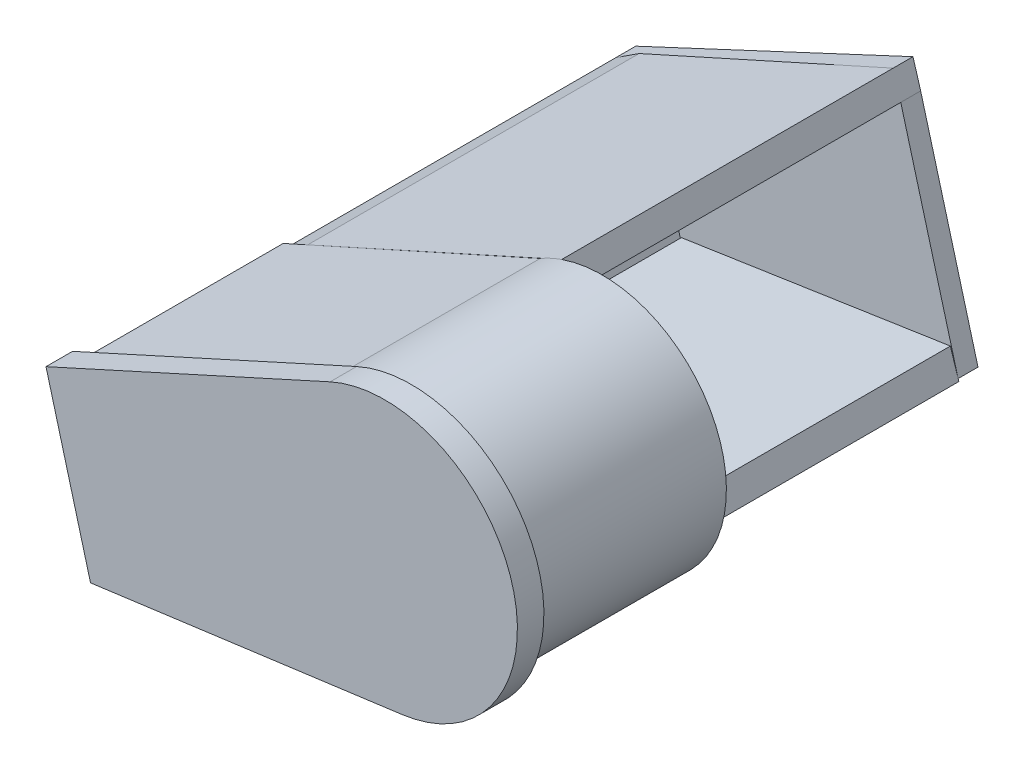
ISO-10303-21;
HEADER;
FILE_DESCRIPTION(('STEP AP214'),'2;1');
FILE_NAME('part.step','',(''),(''),'','','');
FILE_SCHEMA(('AUTOMOTIVE_DESIGN { 1 0 10303 214 1 1 1 1 }'));
ENDSEC;
DATA;
#1=APPLICATION_CONTEXT('core data for automotive mechanical design processes');
#2=APPLICATION_PROTOCOL_DEFINITION('international standard','automotive_design',2000,#1);
#3=PRODUCT_CONTEXT('',#1,'mechanical');
#4=PRODUCT('Part','Part','',(#3));
#5=PRODUCT_RELATED_PRODUCT_CATEGORY('part','',(#4));
#6=PRODUCT_DEFINITION_FORMATION('','',#4);
#7=PRODUCT_DEFINITION_CONTEXT('part definition',#1,'design');
#8=PRODUCT_DEFINITION('design','',#6,#7);
#9=PRODUCT_DEFINITION_SHAPE('','',#8);
#10=(LENGTH_UNIT() NAMED_UNIT(*) SI_UNIT(.MILLI.,.METRE.));
#11=(NAMED_UNIT(*) PLANE_ANGLE_UNIT() SI_UNIT($,.RADIAN.));
#12=(NAMED_UNIT(*) SI_UNIT($,.STERADIAN.) SOLID_ANGLE_UNIT());
#13=UNCERTAINTY_MEASURE_WITH_UNIT(LENGTH_MEASURE(1.E-05),#10,'distance_accuracy_value','');
#14=(GEOMETRIC_REPRESENTATION_CONTEXT(3) GLOBAL_UNCERTAINTY_ASSIGNED_CONTEXT((#13)) GLOBAL_UNIT_ASSIGNED_CONTEXT((#10,
#11,#12)) REPRESENTATION_CONTEXT('',''));
#15=CARTESIAN_POINT('',(0.,0.,0.));
#16=DIRECTION('',(0.,0.,1.));
#17=DIRECTION('',(1.,0.,0.));
#18=AXIS2_PLACEMENT_3D('',#15,#16,#17);
#19=CARTESIAN_POINT('',(0.,0.,-84.));
#20=DIRECTION('',(0.,0.,1.));
#21=DIRECTION('',(1.,0.,0.));
#22=AXIS2_PLACEMENT_3D('',#19,#20,#21);
#23=PLANE('',#22);
#24=DIRECTION('',(0.90601696578967,0.423241370498301,0.));
#25=VECTOR('',#24,1.);
#26=CARTESIAN_POINT('',(-47.9678907221855,-1.86750662905844,-84.));
#27=LINE('',#26,#25);
#28=CARTESIAN_POINT('',(-47.9678907221855,-1.86750662905844,-84.));
#29=VERTEX_POINT('',#28);
#30=CARTESIAN_POINT('',(-6.13749157275297,17.6733586449886,-84.));
#31=VERTEX_POINT('',#30);
#32=EDGE_CURVE('E276',#29,#31,#27,.T.);
#33=ORIENTED_EDGE('',*,*,#32,.F.);
#34=DIRECTION('',(0.837415670836213,0.546566550602884,0.));
#35=VECTOR('',#34,1.);
#36=CARTESIAN_POINT('',(-44.4570682641742,0.42394573740878,-84.));
#37=LINE('',#36,#35);
#38=CARTESIAN_POINT('',(-44.4570682641742,0.42394573740878,-84.));
#39=VERTEX_POINT('',#38);
#40=EDGE_CURVE('E351',#29,#39,#37,.T.);
#41=ORIENTED_EDGE('',*,*,#40,.T.);
#42=DIRECTION('',(0.911871599442209,0.410475560942071,0.));
#43=VECTOR('',#42,1.);
#44=CARTESIAN_POINT('',(-44.4570682641742,0.42394573740878,-84.));
#45=LINE('',#44,#43);
#46=EDGE_CURVE('E293',#39,#31,#45,.T.);
#47=ORIENTED_EDGE('',*,*,#46,.T.);
#48=EDGE_LOOP('',(#33,#41,#47));
#49=FACE_BOUND('',#48,.T.);
#50=ADVANCED_FACE('F73',(#49),#23,.F.);
#51=DIRECTION('',(-0.988123455644098,-0.153662085128267,0.));
#52=VECTOR('',#51,1.);
#53=CARTESIAN_POINT('',(3.67019319079095,-17.9862335505669,-84.));
#54=LINE('',#53,#52);
#55=CARTESIAN_POINT('',(-37.1279364806681,-24.3307096773514,-84.));
#56=VERTEX_POINT('',#55);
#57=CARTESIAN_POINT('',(-40.8961928307478,-24.9167074337488,-84.));
#58=VERTEX_POINT('',#57);
#59=EDGE_CURVE('E90',#56,#58,#54,.T.);
#60=ORIENTED_EDGE('',*,*,#59,.F.);
#61=DIRECTION('',(0.283889596067548,-0.958856974342162,0.));
#62=VECTOR('',#61,1.);
#63=CARTESIAN_POINT('',(-37.1231199205319,-24.346977946224,-84.));
#64=LINE('',#63,#62);
#65=CARTESIAN_POINT('',(-37.1231199205319,-24.346977946224,-84.));
#66=VERTEX_POINT('',#65);
#67=EDGE_CURVE('E355',#56,#66,#64,.T.);
#68=ORIENTED_EDGE('',*,*,#67,.T.);
#69=DIRECTION('',(-0.988791000123282,-0.149306255981453,0.));
#70=VECTOR('',#69,1.);
#71=CARTESIAN_POINT('',(-40.8961928307478,-24.9167074337488,-84.));
#72=LINE('',#71,#70);
#73=EDGE_CURVE('E349',#66,#58,#72,.T.);
#74=ORIENTED_EDGE('',*,*,#73,.T.);
#75=EDGE_LOOP('',(#60,#68,#74));
#76=FACE_BOUND('',#75,.T.);
#77=ADVANCED_FACE('F495',(#76),#23,.F.);
#78=CARTESIAN_POINT('',(0.,0.,-84.));
#79=DIRECTION('',(0.,0.,1.));
#80=DIRECTION('',(1.,0.,0.));
#81=AXIS2_PLACEMENT_3D('',#78,#79,#80);
#82=PLANE('',#81);
#83=CARTESIAN_POINT('',(3.67019319079219,-17.9862335505711,-84.));
#84=VERTEX_POINT('',#83);
#85=CARTESIAN_POINT('',(-36.857705330564,-24.288686302889,-84.));
#86=VERTEX_POINT('',#85);
#87=EDGE_CURVE('E98',#84,#86,#54,.T.);
#88=ORIENTED_EDGE('',*,*,#87,.F.);
#89=DIRECTION('',(0.303979186168957,-0.952678673203121,0.));
#90=VECTOR('',#89,1.);
#91=CARTESIAN_POINT('',(3.7777580074753,-18.3233444828438,-84.));
#92=LINE('',#91,#90);
#93=CARTESIAN_POINT('',(3.7777580074753,-18.3233444828438,-84.));
#94=VERTEX_POINT('',#93);
#95=EDGE_CURVE('E323',#84,#94,#92,.T.);
#96=ORIENTED_EDGE('',*,*,#95,.T.);
#97=DIRECTION('',(-0.988913553374433,-0.148492370013923,0.));
#98=VECTOR('',#97,1.);
#99=CARTESIAN_POINT('',(-36.8161849180462,-24.4188123552901,-84.));
#100=LINE('',#99,#98);
#101=CARTESIAN_POINT('',(-36.8161849180462,-24.4188123552901,-84.));
#102=VERTEX_POINT('',#101);
#103=EDGE_CURVE('E313',#94,#102,#100,.T.);
#104=ORIENTED_EDGE('',*,*,#103,.T.);
#105=DIRECTION('',(-0.303979186168956,0.952678673203121,0.));
#106=VECTOR('',#105,1.);
#107=CARTESIAN_POINT('',(-38.0836108098652,-20.4466666560439,-84.));
#108=LINE('',#107,#106);
#109=EDGE_CURVE('E318',#102,#86,#108,.T.);
#110=ORIENTED_EDGE('',*,*,#109,.T.);
#111=EDGE_LOOP('',(#88,#96,#104,#110));
#112=FACE_BOUND('',#111,.T.);
#113=ADVANCED_FACE('F501',(#112),#82,.F.);
#114=CARTESIAN_POINT('',(0.,0.,-34.));
#115=DIRECTION('',(0.,0.,1.));
#116=DIRECTION('',(1.,0.,0.));
#117=AXIS2_PLACEMENT_3D('',#114,#115,#116);
#118=PLANE('',#117);
#119=DIRECTION('',(-0.907412634685227,-0.42024077671451,0.));
#120=VECTOR('',#119,1.);
#121=CARTESIAN_POINT('',(-4.98355760127701,13.7758659161011,-34.));
#122=LINE('',#121,#120);
#123=CARTESIAN_POINT('',(-43.1590575086167,-3.90396475772491,-34.));
#124=VERTEX_POINT('',#123);
#125=CARTESIAN_POINT('',(-43.1736933308374,-3.91074289708818,-34.));
#126=VERTEX_POINT('',#125);
#127=EDGE_CURVE('E282',#124,#126,#122,.T.);
#128=ORIENTED_EDGE('',*,*,#127,.F.);
#129=DIRECTION('',(-0.293314165556702,0.956016108799311,0.));
#130=VECTOR('',#129,1.);
#131=CARTESIAN_POINT('',(-38.0836108098652,-20.4466666560439,-34.));
#132=LINE('',#131,#130);
#133=CARTESIAN_POINT('',(-38.0836108098652,-20.4466666560439,-34.));
#134=VERTEX_POINT('',#133);
#135=EDGE_CURVE('E399',#134,#124,#132,.T.);
#136=ORIENTED_EDGE('',*,*,#135,.F.);
#137=DIRECTION('',(-0.303979186168956,0.952678673203121,0.));
#138=VECTOR('',#137,1.);
#139=CARTESIAN_POINT('',(-38.0836108098652,-20.4466666560439,-34.));
#140=LINE('',#139,#138);
#141=CARTESIAN_POINT('',(-36.8521606666918,-24.3060634236309,-34.));
#142=VERTEX_POINT('',#141);
#143=EDGE_CURVE('E331',#142,#134,#140,.T.);
#144=ORIENTED_EDGE('',*,*,#143,.F.);
#145=DIRECTION('',(-0.988791000123282,-0.149306255981453,0.));
#146=VECTOR('',#145,1.);
#147=CARTESIAN_POINT('',(5.01864887489931,-17.9836213637942,-34.));
#148=LINE('',#147,#146);
#149=CARTESIAN_POINT('',(-37.1231199205319,-24.346977946224,-34.));
#150=VERTEX_POINT('',#149);
#151=EDGE_CURVE('E405',#142,#150,#148,.T.);
#152=ORIENTED_EDGE('',*,*,#151,.T.);
#153=DIRECTION('',(0.283889596067548,-0.958856974342162,0.));
#154=VECTOR('',#153,1.);
#155=CARTESIAN_POINT('',(-37.1231199205319,-24.346977946224,-34.));
#156=LINE('',#155,#154);
#157=EDGE_CURVE('E352',#126,#150,#156,.T.);
#158=ORIENTED_EDGE('',*,*,#157,.F.);
#159=EDGE_LOOP('',(#128,#136,#144,#152,#158));
#160=FACE_BOUND('',#159,.T.);
#161=ADVANCED_FACE('F526',(#160),#118,.F.);
#162=DIRECTION('',(0.911871599442209,0.410475560942071,0.));
#163=VECTOR('',#162,1.);
#164=CARTESIAN_POINT('',(-44.4570682641742,0.42394573740878,-34.));
#165=LINE('',#164,#163);
#166=CARTESIAN_POINT('',(-9.16103447280697,16.3123222132242,-34.));
#167=VERTEX_POINT('',#166);
#168=CARTESIAN_POINT('',(-6.13749157275297,17.6733586449886,-34.));
#169=VERTEX_POINT('',#168);
#170=EDGE_CURVE('E297',#167,#169,#165,.T.);
#171=ORIENTED_EDGE('',*,*,#170,.F.);
#172=CARTESIAN_POINT('',(0.,0.,-34.));
#173=DIRECTION('',(0.,0.,-1.));
#174=DIRECTION('',(-1.,0.,0.));
#175=AXIS2_PLACEMENT_3D('',#172,#173,#174);
#176=CIRCLE('',#175,18.7087254670115);
#177=EDGE_CURVE('E374',#167,#169,#176,.T.);
#178=ORIENTED_EDGE('',*,*,#177,.T.);
#179=EDGE_LOOP('',(#171,#178));
#180=FACE_BOUND('',#179,.T.);
#181=ADVANCED_FACE('F529',(#180),#118,.F.);
#182=DIRECTION('',(0.283889596067548,-0.958856974342161,0.));
#183=VECTOR('',#182,1.);
#184=CARTESIAN_POINT('',(-6.13749157275297,17.6733586449886,-34.));
#185=LINE('',#184,#183);
#186=CARTESIAN_POINT('',(-4.98355760127701,13.7758659161011,-34.));
#187=VERTEX_POINT('',#186);
#188=EDGE_CURVE('E294',#169,#187,#185,.T.);
#189=ORIENTED_EDGE('',*,*,#188,.F.);
#190=CARTESIAN_POINT('',(3.77775800747527,-18.3233444828438,-34.));
#191=VERTEX_POINT('',#190);
#192=EDGE_CURVE('E375',#169,#191,#176,.T.);
#193=ORIENTED_EDGE('',*,*,#192,.T.);
#194=DIRECTION('',(0.303979186168957,-0.952678673203121,0.));
#195=VECTOR('',#194,1.);
#196=CARTESIAN_POINT('',(3.7777580074753,-18.3233444828438,-34.));
#197=LINE('',#196,#195);
#198=CARTESIAN_POINT('',(2.49993071514775,-14.3186005239573,-34.));
#199=VERTEX_POINT('',#198);
#200=EDGE_CURVE('E317',#199,#191,#197,.T.);
#201=ORIENTED_EDGE('',*,*,#200,.F.);
#202=DIRECTION('',(-0.988791000123282,-0.149306255981453,0.));
#203=VECTOR('',#202,1.);
#204=CARTESIAN_POINT('',(4.4214238509735,-14.0284573633011,-34.));
#205=LINE('',#204,#203);
#206=CARTESIAN_POINT('',(4.4214238509735,-14.0284573633011,-34.));
#207=VERTEX_POINT('',#206);
#208=EDGE_CURVE('E402',#207,#199,#205,.T.);
#209=ORIENTED_EDGE('',*,*,#208,.F.);
#210=CARTESIAN_POINT('',(0.,0.,-34.));
#211=DIRECTION('',(0.,0.,-1.));
#212=DIRECTION('',(-1.,0.,0.));
#213=AXIS2_PLACEMENT_3D('',#210,#211,#212);
#214=CIRCLE('',#213,14.7087254670115);
#215=CARTESIAN_POINT('',(-4.42142385097353,14.0284573633011,-34.));
#216=VERTEX_POINT('',#215);
#217=EDGE_CURVE('E373',#216,#207,#214,.T.);
#218=ORIENTED_EDGE('',*,*,#217,.F.);
#219=DIRECTION('',(0.912145278941702,0.409867039543757,0.));
#220=VECTOR('',#219,1.);
#221=CARTESIAN_POINT('',(-43.300858444141,-3.44178462964706,-34.));
#222=LINE('',#221,#220);
#223=EDGE_CURVE('E394',#187,#216,#222,.T.);
#224=ORIENTED_EDGE('',*,*,#223,.F.);
#225=EDGE_LOOP('',(#189,#193,#201,#209,#218,#224));
#226=FACE_BOUND('',#225,.T.);
#227=ADVANCED_FACE('F510',(#226),#118,.F.);
#228=CARTESIAN_POINT('',(-37.1231199205319,-24.346977946224,-84.));
#229=DIRECTION('',(-0.958856974342162,-0.283889596067548,0.));
#230=DIRECTION('',(0.283889596067548,-0.958856974342162,0.));
#231=AXIS2_PLACEMENT_3D('',#228,#229,#230);
#232=PLANE('',#231);
#233=DIRECTION('',(0.,0.,1.));
#234=VECTOR('',#233,1.);
#235=CARTESIAN_POINT('',(-43.1736933308374,-3.91074289708818,-84.));
#236=LINE('',#235,#234);
#237=CARTESIAN_POINT('',(-43.1736933308374,-3.91074289708818,-84.));
#238=VERTEX_POINT('',#237);
#239=EDGE_CURVE('E306',#238,#126,#236,.T.);
#240=ORIENTED_EDGE('',*,*,#239,.T.);
#241=ORIENTED_EDGE('',*,*,#157,.T.);
#242=DIRECTION('',(0.,0.,1.));
#243=VECTOR('',#242,1.);
#244=CARTESIAN_POINT('',(-37.1231199205319,-24.346977946224,-84.));
#245=LINE('',#244,#243);
#246=EDGE_CURVE('E359',#66,#150,#245,.T.);
#247=ORIENTED_EDGE('',*,*,#246,.F.);
#248=ORIENTED_EDGE('',*,*,#67,.F.);
#249=EDGE_CURVE('E356',#238,#56,#64,.T.);
#250=ORIENTED_EDGE('',*,*,#249,.F.);
#251=EDGE_LOOP('',(#240,#241,#247,#248,#250));
#252=FACE_BOUND('',#251,.T.);
#253=ADVANCED_FACE('F506',(#252),#232,.F.);
#254=DIRECTION('',(-0.988913553374433,-0.148492370013923,0.));
#255=VECTOR('',#254,1.);
#256=CARTESIAN_POINT('',(-36.8161849180462,-24.4188123552901,-34.));
#257=LINE('',#256,#255);
#258=CARTESIAN_POINT('',(1.77026498516536,-18.6247837700818,-34.));
#259=VERTEX_POINT('',#258);
#260=EDGE_CURVE('E328',#191,#259,#257,.T.);
#261=ORIENTED_EDGE('',*,*,#260,.F.);
#262=EDGE_CURVE('E376',#191,#259,#176,.T.);
#263=ORIENTED_EDGE('',*,*,#262,.T.);
#264=EDGE_LOOP('',(#261,#263));
#265=FACE_BOUND('',#264,.T.);
#266=ADVANCED_FACE('F509',(#265),#118,.F.);
#267=DIRECTION('',(0.837415670836213,0.546566550602884,0.));
#268=VECTOR('',#267,1.);
#269=CARTESIAN_POINT('',(-44.4570682641742,0.42394573740878,-34.));
#270=LINE('',#269,#268);
#271=CARTESIAN_POINT('',(-47.9678907221855,-1.86750662905844,-34.));
#272=VERTEX_POINT('',#271);
#273=CARTESIAN_POINT('',(-44.4570682641742,0.42394573740878,-34.));
#274=VERTEX_POINT('',#273);
#275=EDGE_CURVE('E348',#272,#274,#270,.T.);
#276=ORIENTED_EDGE('',*,*,#275,.F.);
#277=DIRECTION('',(-0.293314165556702,0.956016108799311,0.));
#278=VECTOR('',#277,1.);
#279=CARTESIAN_POINT('',(-41.9076752450625,-21.6199233182707,-34.));
#280=LINE('',#279,#278);
#281=CARTESIAN_POINT('',(-48.1603799211926,-1.24011526297381,-34.));
#282=VERTEX_POINT('',#281);
#283=EDGE_CURVE('E409',#272,#282,#280,.T.);
#284=ORIENTED_EDGE('',*,*,#283,.T.);
#285=DIRECTION('',(0.912145278941702,0.409867039543757,0.));
#286=VECTOR('',#285,1.);
#287=CARTESIAN_POINT('',(-44.940326602316,0.20679648611975,-34.));
#288=LINE('',#287,#286);
#289=EDGE_CURVE('E391',#282,#274,#288,.T.);
#290=ORIENTED_EDGE('',*,*,#289,.T.);
#291=EDGE_LOOP('',(#276,#284,#290));
#292=FACE_BOUND('',#291,.T.);
#293=ADVANCED_FACE('F531',(#292),#118,.F.);
#294=CARTESIAN_POINT('',(1.17834834539366,0.,-4.));
#295=DIRECTION('',(0.,0.,1.));
#296=DIRECTION('',(1.,0.,0.));
#297=AXIS2_PLACEMENT_3D('',#294,#295,#296);
#298=CYLINDRICAL_SURFACE('',#297,20.);
#299=CARTESIAN_POINT('',(1.17834834539366,0.,0.));
#300=DIRECTION('',(0.,0.,1.));
#301=DIRECTION('',(1.,0.,0.));
#302=AXIS2_PLACEMENT_3D('',#299,#300,#301);
#303=CIRCLE('',#302,20.);
#304=CARTESIAN_POINT('',(3.83433501679677,-19.822858895763,0.));
#305=VERTEX_POINT('',#304);
#306=CARTESIAN_POINT('',(-7.08482247893124,18.2131822570364,0.));
#307=VERTEX_POINT('',#306);
#308=EDGE_CURVE('E443',#305,#307,#303,.T.);
#309=ORIENTED_EDGE('',*,*,#308,.F.);
#310=DIRECTION('',(0.,0.,1.));
#311=VECTOR('',#310,1.);
#312=CARTESIAN_POINT('',(3.83433501679677,-19.822858895763,-4.));
#313=LINE('',#312,#311);
#314=CARTESIAN_POINT('',(3.83433501679677,-19.822858895763,-4.));
#315=VERTEX_POINT('',#314);
#316=EDGE_CURVE('E12',#315,#305,#313,.T.);
#317=ORIENTED_EDGE('',*,*,#316,.F.);
#318=CARTESIAN_POINT('',(1.17834834539366,0.,-4.));
#319=DIRECTION('',(0.,0.,1.));
#320=DIRECTION('',(1.,0.,0.));
#321=AXIS2_PLACEMENT_3D('',#318,#319,#320);
#322=CIRCLE('',#321,20.);
#323=CARTESIAN_POINT('',(-7.08482247893124,18.2131822570364,-4.));
#324=VERTEX_POINT('',#323);
#325=EDGE_CURVE('E444',#315,#324,#322,.T.);
#326=ORIENTED_EDGE('',*,*,#325,.T.);
#327=DIRECTION('',(0.,0.,1.));
#328=VECTOR('',#327,1.);
#329=CARTESIAN_POINT('',(-7.08482247893124,18.2131822570364,-4.));
#330=LINE('',#329,#328);
#331=EDGE_CURVE('E77',#324,#307,#330,.T.);
#332=ORIENTED_EDGE('',*,*,#331,.T.);
#333=EDGE_LOOP('',(#309,#317,#326,#332));
#334=FACE_BOUND('',#333,.T.);
#335=ADVANCED_FACE('F75',(#334),#298,.T.);
#336=CARTESIAN_POINT('',(3.83433501679677,-19.822858895763,-4.));
#337=DIRECTION('',(0.132799333570155,-0.991142944788149,0.));
#338=DIRECTION('',(0.991142944788148,0.132799333570155,0.));
#339=AXIS2_PLACEMENT_3D('',#336,#337,#338);
#340=PLANE('',#339);
#341=DIRECTION('',(0.991142944788148,0.132799333570155,0.));
#342=VECTOR('',#341,1.);
#343=CARTESIAN_POINT('',(3.83433501679677,-19.822858895763,0.));
#344=LINE('',#343,#342);
#345=CARTESIAN_POINT('',(-43.2302468250683,-26.1288565686755,0.));
#346=VERTEX_POINT('',#345);
#347=EDGE_CURVE('E448',#346,#305,#344,.T.);
#348=ORIENTED_EDGE('',*,*,#347,.F.);
#349=DIRECTION('',(0.,0.,1.));
#350=VECTOR('',#349,1.);
#351=CARTESIAN_POINT('',(-43.2302468250683,-26.1288565686755,-4.));
#352=LINE('',#351,#350);
#353=CARTESIAN_POINT('',(-43.2302468250683,-26.1288565686755,-4.));
#354=VERTEX_POINT('',#353);
#355=EDGE_CURVE('E82',#354,#346,#352,.T.);
#356=ORIENTED_EDGE('',*,*,#355,.F.);
#357=DIRECTION('',(0.991142944788148,0.132799333570155,0.));
#358=VECTOR('',#357,1.);
#359=CARTESIAN_POINT('',(3.83433501679677,-19.822858895763,-4.));
#360=LINE('',#359,#358);
#361=EDGE_CURVE('E454',#354,#315,#360,.T.);
#362=ORIENTED_EDGE('',*,*,#361,.T.);
#363=ORIENTED_EDGE('',*,*,#316,.T.);
#364=EDGE_LOOP('',(#348,#356,#362,#363));
#365=FACE_BOUND('',#364,.T.);
#366=ADVANCED_FACE('F480',(#365),#340,.T.);
#367=CARTESIAN_POINT('',(-49.9459074103825,-1.2325390620731,-4.));
#368=DIRECTION('',(-0.96549097930674,-0.260436496822762,0.));
#369=DIRECTION('',(0.260436496822762,-0.96549097930674,0.));
#370=AXIS2_PLACEMENT_3D('',#367,#368,#369);
#371=PLANE('',#370);
#372=DIRECTION('',(0.260436496822762,-0.96549097930674,0.));
#373=VECTOR('',#372,1.);
#374=CARTESIAN_POINT('',(-49.9459074103825,-1.2325390620731,0.));
#375=LINE('',#374,#373);
#376=CARTESIAN_POINT('',(-49.9459074103825,-1.2325390620731,0.));
#377=VERTEX_POINT('',#376);
#378=EDGE_CURVE('E462',#377,#346,#375,.T.);
#379=ORIENTED_EDGE('',*,*,#378,.F.);
#380=DIRECTION('',(0.,0.,1.));
#381=VECTOR('',#380,1.);
#382=CARTESIAN_POINT('',(-49.9459074103825,-1.2325390620731,-4.));
#383=LINE('',#382,#381);
#384=CARTESIAN_POINT('',(-49.9459074103825,-1.2325390620731,-4.));
#385=VERTEX_POINT('',#384);
#386=EDGE_CURVE('E467',#385,#377,#383,.T.);
#387=ORIENTED_EDGE('',*,*,#386,.F.);
#388=DIRECTION('',(0.260436496822762,-0.96549097930674,0.));
#389=VECTOR('',#388,1.);
#390=CARTESIAN_POINT('',(-49.9459074103825,-1.2325390620731,-4.));
#391=LINE('',#390,#389);
#392=EDGE_CURVE('E451',#385,#354,#391,.T.);
#393=ORIENTED_EDGE('',*,*,#392,.T.);
#394=ORIENTED_EDGE('',*,*,#355,.T.);
#395=EDGE_LOOP('',(#379,#387,#393,#394));
#396=FACE_BOUND('',#395,.T.);
#397=ADVANCED_FACE('F486',(#396),#371,.T.);
#398=CARTESIAN_POINT('',(-7.08482247893124,18.2131822570364,-4.));
#399=DIRECTION('',(-0.413158541216245,0.91065911285182,0.));
#400=DIRECTION('',(-0.91065911285182,-0.413158541216245,0.));
#401=AXIS2_PLACEMENT_3D('',#398,#399,#400);
#402=PLANE('',#401);
#403=DIRECTION('',(-0.91065911285182,-0.413158541216245,0.));
#404=VECTOR('',#403,1.);
#405=CARTESIAN_POINT('',(-7.08482247893124,18.2131822570364,0.));
#406=LINE('',#405,#404);
#407=EDGE_CURVE('E459',#307,#377,#406,.T.);
#408=ORIENTED_EDGE('',*,*,#407,.F.);
#409=ORIENTED_EDGE('',*,*,#331,.F.);
#410=DIRECTION('',(-0.91065911285182,-0.413158541216245,0.));
#411=VECTOR('',#410,1.);
#412=CARTESIAN_POINT('',(-7.08482247893124,18.2131822570364,-4.));
#413=LINE('',#412,#411);
#414=EDGE_CURVE('E447',#324,#385,#413,.T.);
#415=ORIENTED_EDGE('',*,*,#414,.T.);
#416=ORIENTED_EDGE('',*,*,#386,.T.);
#417=EDGE_LOOP('',(#408,#409,#415,#416));
#418=FACE_BOUND('',#417,.T.);
#419=ADVANCED_FACE('F475',(#418),#402,.T.);
#420=CARTESIAN_POINT('',(1.17834834539366,0.,-4.));
#421=DIRECTION('',(0.,0.,1.));
#422=DIRECTION('',(1.,0.,0.));
#423=AXIS2_PLACEMENT_3D('',#420,#421,#422);
#424=PLANE('',#423);
#425=DIRECTION('',(-0.293314165556702,0.956016108799311,0.));
#426=VECTOR('',#425,1.);
#427=CARTESIAN_POINT('',(-41.9076752450625,-21.6199233182707,-4.));
#428=LINE('',#427,#426);
#429=CARTESIAN_POINT('',(-40.8961928307478,-24.9167074337488,-4.));
#430=VERTEX_POINT('',#429);
#431=CARTESIAN_POINT('',(-48.1603799211926,-1.24011526297382,-4.));
#432=VERTEX_POINT('',#431);
#433=EDGE_CURVE('E426',#430,#432,#428,.T.);
#434=ORIENTED_EDGE('',*,*,#433,.F.);
#435=DIRECTION('',(-0.988791000123282,-0.149306255981453,0.));
#436=VECTOR('',#435,1.);
#437=CARTESIAN_POINT('',(5.01864887489931,-17.9836213637942,-4.));
#438=LINE('',#437,#436);
#439=CARTESIAN_POINT('',(0.225605656007296,-18.7073651455244,-4.));
#440=VERTEX_POINT('',#439);
#441=EDGE_CURVE('E423',#440,#430,#438,.T.);
#442=ORIENTED_EDGE('',*,*,#441,.F.);
#443=CARTESIAN_POINT('',(0.,0.,-4.));
#444=DIRECTION('',(0.,0.,-1.));
#445=DIRECTION('',(-1.,0.,0.));
#446=AXIS2_PLACEMENT_3D('',#443,#444,#445);
#447=CIRCLE('',#446,18.7087254670115);
#448=CARTESIAN_POINT('',(-9.39366414514716,16.1794772019426,-4.));
#449=VERTEX_POINT('',#448);
#450=EDGE_CURVE('E370',#449,#440,#447,.T.);
#451=ORIENTED_EDGE('',*,*,#450,.F.);
#452=DIRECTION('',(0.912145278941702,0.409867039543757,0.));
#453=VECTOR('',#452,1.);
#454=CARTESIAN_POINT('',(-44.940326602316,0.20679648611975,-4.));
#455=LINE('',#454,#453);
#456=EDGE_CURVE('E390',#432,#449,#455,.T.);
#457=ORIENTED_EDGE('',*,*,#456,.F.);
#458=EDGE_LOOP('',(#434,#442,#451,#457));
#459=FACE_BOUND('',#458,.T.);
#460=ORIENTED_EDGE('',*,*,#325,.F.);
#461=ORIENTED_EDGE('',*,*,#361,.F.);
#462=ORIENTED_EDGE('',*,*,#392,.F.);
#463=ORIENTED_EDGE('',*,*,#414,.F.);
#464=EDGE_LOOP('',(#460,#461,#462,#463));
#465=FACE_BOUND('',#464,.T.);
#466=ADVANCED_FACE('F483',(#459,#465),#424,.F.);
#467=CARTESIAN_POINT('',(1.17834834539366,0.,0.));
#468=DIRECTION('',(0.,0.,1.));
#469=DIRECTION('',(1.,0.,0.));
#470=AXIS2_PLACEMENT_3D('',#467,#468,#469);
#471=PLANE('',#470);
#472=ORIENTED_EDGE('',*,*,#308,.T.);
#473=ORIENTED_EDGE('',*,*,#407,.T.);
#474=ORIENTED_EDGE('',*,*,#378,.T.);
#475=ORIENTED_EDGE('',*,*,#347,.T.);
#476=EDGE_LOOP('',(#472,#473,#474,#475));
#477=FACE_BOUND('',#476,.T.);
#478=ADVANCED_FACE('F477',(#477),#471,.T.);
#479=CARTESIAN_POINT('',(-44.940326602316,0.20679648611975,-34.));
#480=DIRECTION('',(0.409867039543757,-0.912145278941702,0.));
#481=DIRECTION('',(0.912145278941702,0.409867039543758,0.));
#482=AXIS2_PLACEMENT_3D('',#479,#480,#481);
#483=PLANE('',#482);
#484=DIRECTION('',(0.,0.,1.));
#485=VECTOR('',#484,1.);
#486=CARTESIAN_POINT('',(-9.39366414514716,16.1794772019426,-34.));
#487=LINE('',#486,#485);
#488=CARTESIAN_POINT('',(-9.39366414514716,16.1794772019426,-34.));
#489=VERTEX_POINT('',#488);
#490=EDGE_CURVE('E387',#489,#449,#487,.T.);
#491=ORIENTED_EDGE('',*,*,#490,.F.);
#492=EDGE_CURVE('E395',#274,#489,#288,.T.);
#493=ORIENTED_EDGE('',*,*,#492,.F.);
#494=ORIENTED_EDGE('',*,*,#289,.F.);
#495=DIRECTION('',(0.,0.,1.));
#496=VECTOR('',#495,1.);
#497=CARTESIAN_POINT('',(-48.1603799211926,-1.24011526297381,-34.));
#498=LINE('',#497,#496);
#499=EDGE_CURVE('E411',#282,#432,#498,.T.);
#500=ORIENTED_EDGE('',*,*,#499,.T.);
#501=ORIENTED_EDGE('',*,*,#456,.T.);
#502=EDGE_LOOP('',(#491,#493,#494,#500,#501));
#503=FACE_BOUND('',#502,.T.);
#504=ADVANCED_FACE('F540',(#503),#483,.F.);
#505=CARTESIAN_POINT('',(5.01864887489931,-17.9836213637942,-34.));
#506=DIRECTION('',(-0.149306255981453,0.988791000123282,0.));
#507=DIRECTION('',(-0.988791000123282,-0.149306255981453,0.));
#508=AXIS2_PLACEMENT_3D('',#505,#506,#507);
#509=PLANE('',#508);
#510=DIRECTION('',(0.,0.,1.));
#511=VECTOR('',#510,1.);
#512=CARTESIAN_POINT('',(0.225605656007296,-18.7073651455244,-34.));
#513=LINE('',#512,#511);
#514=CARTESIAN_POINT('',(0.225605656007296,-18.7073651455244,-34.));
#515=VERTEX_POINT('',#514);
#516=EDGE_CURVE('E379',#440,#515,#513,.F.);
#517=ORIENTED_EDGE('',*,*,#516,.F.);
#518=ORIENTED_EDGE('',*,*,#441,.T.);
#519=DIRECTION('',(0.,0.,1.));
#520=VECTOR('',#519,1.);
#521=CARTESIAN_POINT('',(-40.8961928307478,-24.9167074337488,-34.));
#522=LINE('',#521,#520);
#523=EDGE_CURVE('E431',#58,#430,#522,.T.);
#524=ORIENTED_EDGE('',*,*,#523,.F.);
#525=ORIENTED_EDGE('',*,*,#73,.F.);
#526=ORIENTED_EDGE('',*,*,#246,.T.);
#527=ORIENTED_EDGE('',*,*,#151,.F.);
#528=EDGE_CURVE('E406',#515,#142,#148,.T.);
#529=ORIENTED_EDGE('',*,*,#528,.F.);
#530=EDGE_LOOP('',(#517,#518,#524,#525,#526,#527,#529));
#531=FACE_BOUND('',#530,.T.);
#532=ADVANCED_FACE('F536',(#531),#509,.F.);
#533=CARTESIAN_POINT('',(-43.300858444141,-3.44178462964706,-34.));
#534=DIRECTION('',(0.409867039543757,-0.912145278941702,0.));
#535=DIRECTION('',(0.912145278941702,0.409867039543758,0.));
#536=AXIS2_PLACEMENT_3D('',#533,#534,#535);
#537=PLANE('',#536);
#538=CARTESIAN_POINT('',(-43.300858444141,-3.44178462964706,-34.));
#539=VERTEX_POINT('',#538);
#540=EDGE_CURVE('E396',#539,#187,#222,.T.);
#541=ORIENTED_EDGE('',*,*,#540,.T.);
#542=ORIENTED_EDGE('',*,*,#223,.T.);
#543=DIRECTION('',(0.,0.,1.));
#544=VECTOR('',#543,1.);
#545=CARTESIAN_POINT('',(-4.4214238509735,14.0284573633011,-34.));
#546=LINE('',#545,#544);
#547=CARTESIAN_POINT('',(-4.4214238509735,14.0284573633011,-4.));
#548=VERTEX_POINT('',#547);
#549=EDGE_CURVE('E440',#216,#548,#546,.T.);
#550=ORIENTED_EDGE('',*,*,#549,.T.);
#551=DIRECTION('',(0.912145278941702,0.409867039543757,0.));
#552=VECTOR('',#551,1.);
#553=CARTESIAN_POINT('',(-43.300858444141,-3.44178462964706,-4.));
#554=LINE('',#553,#552);
#555=CARTESIAN_POINT('',(-43.300858444141,-3.44178462964706,-4.));
#556=VERTEX_POINT('',#555);
#557=EDGE_CURVE('E414',#556,#548,#554,.T.);
#558=ORIENTED_EDGE('',*,*,#557,.F.);
#559=DIRECTION('',(0.,0.,1.));
#560=VECTOR('',#559,1.);
#561=CARTESIAN_POINT('',(-43.300858444141,-3.44178462964706,-34.));
#562=LINE('',#561,#560);
#563=EDGE_CURVE('E438',#539,#556,#562,.T.);
#564=ORIENTED_EDGE('',*,*,#563,.F.);
#565=EDGE_LOOP('',(#541,#542,#550,#558,#564));
#566=FACE_BOUND('',#565,.T.);
#567=ADVANCED_FACE('F539',(#566),#537,.T.);
#568=CARTESIAN_POINT('',(-38.0836108098652,-20.4466666560439,-34.));
#569=DIRECTION('',(0.956016108799311,0.293314165556702,0.));
#570=DIRECTION('',(-0.293314165556702,0.956016108799311,0.));
#571=AXIS2_PLACEMENT_3D('',#568,#569,#570);
#572=PLANE('',#571);
#573=DIRECTION('',(-0.293314165556702,0.956016108799311,0.));
#574=VECTOR('',#573,1.);
#575=CARTESIAN_POINT('',(-38.0836108098652,-20.4466666560439,-4.));
#576=LINE('',#575,#574);
#577=CARTESIAN_POINT('',(-38.0836108098652,-20.4466666560439,-4.));
#578=VERTEX_POINT('',#577);
#579=EDGE_CURVE('E417',#578,#556,#576,.T.);
#580=ORIENTED_EDGE('',*,*,#579,.F.);
#581=DIRECTION('',(0.,0.,1.));
#582=VECTOR('',#581,1.);
#583=CARTESIAN_POINT('',(-38.0836108098652,-20.4466666560439,-34.));
#584=LINE('',#583,#582);
#585=EDGE_CURVE('E436',#134,#578,#584,.T.);
#586=ORIENTED_EDGE('',*,*,#585,.F.);
#587=ORIENTED_EDGE('',*,*,#135,.T.);
#588=DIRECTION('',(-0.293314165556702,0.956016108799311,0.));
#589=VECTOR('',#588,1.);
#590=CARTESIAN_POINT('',(-38.0836108098652,-20.4466666560439,-34.));
#591=LINE('',#590,#589);
#592=EDGE_CURVE('E309',#124,#539,#591,.T.);
#593=ORIENTED_EDGE('',*,*,#592,.T.);
#594=ORIENTED_EDGE('',*,*,#563,.T.);
#595=EDGE_LOOP('',(#580,#586,#587,#593,#594));
#596=FACE_BOUND('',#595,.T.);
#597=ADVANCED_FACE('F544',(#596),#572,.T.);
#598=CARTESIAN_POINT('',(4.4214238509735,-14.0284573633011,-34.));
#599=DIRECTION('',(-0.149306255981453,0.988791000123282,0.));
#600=DIRECTION('',(-0.988791000123282,-0.149306255981453,0.));
#601=AXIS2_PLACEMENT_3D('',#598,#599,#600);
#602=PLANE('',#601);
#603=ORIENTED_EDGE('',*,*,#208,.T.);
#604=DIRECTION('',(0.,0.,1.));
#605=VECTOR('',#604,1.);
#606=CARTESIAN_POINT('',(2.49993071514774,-14.3186005239573,-84.));
#607=LINE('',#606,#605);
#608=CARTESIAN_POINT('',(2.49993071514774,-14.3186005239573,-84.));
#609=VERTEX_POINT('',#608);
#610=EDGE_CURVE('E339',#609,#199,#607,.T.);
#611=ORIENTED_EDGE('',*,*,#610,.F.);
#612=DIRECTION('',(0.988791000123282,0.149306255981453,0.));
#613=VECTOR('',#612,1.);
#614=CARTESIAN_POINT('',(2.49993071514774,-14.3186005239573,-84.));
#615=LINE('',#614,#613);
#616=CARTESIAN_POINT('',(-38.0836108098652,-20.4466666560439,-84.));
#617=VERTEX_POINT('',#616);
#618=EDGE_CURVE('E320',#617,#609,#615,.T.);
#619=ORIENTED_EDGE('',*,*,#618,.F.);
#620=DIRECTION('',(0.,0.,1.));
#621=VECTOR('',#620,1.);
#622=CARTESIAN_POINT('',(-38.0836108098652,-20.4466666560439,-84.));
#623=LINE('',#622,#621);
#624=EDGE_CURVE('E342',#617,#134,#623,.T.);
#625=ORIENTED_EDGE('',*,*,#624,.T.);
#626=ORIENTED_EDGE('',*,*,#585,.T.);
#627=DIRECTION('',(-0.988791000123282,-0.149306255981453,0.));
#628=VECTOR('',#627,1.);
#629=CARTESIAN_POINT('',(4.4214238509735,-14.0284573633011,-4.));
#630=LINE('',#629,#628);
#631=CARTESIAN_POINT('',(4.4214238509735,-14.0284573633011,-4.));
#632=VERTEX_POINT('',#631);
#633=EDGE_CURVE('E420',#632,#578,#630,.T.);
#634=ORIENTED_EDGE('',*,*,#633,.F.);
#635=DIRECTION('',(0.,0.,1.));
#636=VECTOR('',#635,1.);
#637=CARTESIAN_POINT('',(4.4214238509735,-14.0284573633011,-34.));
#638=LINE('',#637,#636);
#639=EDGE_CURVE('E434',#207,#632,#638,.T.);
#640=ORIENTED_EDGE('',*,*,#639,.F.);
#641=EDGE_LOOP('',(#603,#611,#619,#625,#626,#634,#640));
#642=FACE_BOUND('',#641,.T.);
#643=ADVANCED_FACE('F534',(#642),#602,.T.);
#644=CARTESIAN_POINT('',(-41.9076752450625,-21.6199233182707,-34.));
#645=DIRECTION('',(0.956016108799311,0.293314165556702,0.));
#646=DIRECTION('',(-0.293314165556702,0.956016108799311,0.));
#647=AXIS2_PLACEMENT_3D('',#644,#645,#646);
#648=PLANE('',#647);
#649=ORIENTED_EDGE('',*,*,#433,.T.);
#650=ORIENTED_EDGE('',*,*,#499,.F.);
#651=ORIENTED_EDGE('',*,*,#283,.F.);
#652=DIRECTION('',(0.,0.,1.));
#653=VECTOR('',#652,1.);
#654=CARTESIAN_POINT('',(-47.9678907221855,-1.86750662905844,-84.));
#655=LINE('',#654,#653);
#656=EDGE_CURVE('E367',#29,#272,#655,.T.);
#657=ORIENTED_EDGE('',*,*,#656,.F.);
#658=DIRECTION('',(0.,0.,1.));
#659=VECTOR('',#658,1.);
#660=CARTESIAN_POINT('',(-47.9678907221855,-1.86750662905844,-87.));
#661=LINE('',#660,#659);
#662=CARTESIAN_POINT('',(-47.9678907221855,-1.86750662905844,-87.));
#663=VERTEX_POINT('',#662);
#664=EDGE_CURVE('E956',#663,#29,#661,.T.);
#665=ORIENTED_EDGE('',*,*,#664,.F.);
#666=DIRECTION('',(-0.293314165556702,0.956016108799311,0.));
#667=VECTOR('',#666,1.);
#668=CARTESIAN_POINT('',(-40.8961928307478,-24.9167074337488,-87.));
#669=LINE('',#668,#667);
#670=CARTESIAN_POINT('',(-40.8961928307478,-24.9167074337488,-87.));
#671=VERTEX_POINT('',#670);
#672=EDGE_CURVE('E952',#671,#663,#669,.T.);
#673=ORIENTED_EDGE('',*,*,#672,.F.);
#674=DIRECTION('',(0.,0.,1.));
#675=VECTOR('',#674,1.);
#676=CARTESIAN_POINT('',(-40.8961928307478,-24.9167074337488,-87.));
#677=LINE('',#676,#675);
#678=EDGE_CURVE('E286',#671,#58,#677,.T.);
#679=ORIENTED_EDGE('',*,*,#678,.T.);
#680=ORIENTED_EDGE('',*,*,#523,.T.);
#681=EDGE_LOOP('',(#649,#650,#651,#657,#665,#673,#679,#680));
#682=FACE_BOUND('',#681,.T.);
#683=ADVANCED_FACE('F524',(#682),#648,.F.);
#684=CARTESIAN_POINT('',(0.,0.,-34.));
#685=DIRECTION('',(0.,0.,1.));
#686=DIRECTION('',(1.,0.,0.));
#687=AXIS2_PLACEMENT_3D('',#684,#685,#686);
#688=CYLINDRICAL_SURFACE('',#687,18.7087254670115);
#689=EDGE_CURVE('E371',#489,#167,#176,.T.);
#690=ORIENTED_EDGE('',*,*,#689,.F.);
#691=ORIENTED_EDGE('',*,*,#490,.T.);
#692=ORIENTED_EDGE('',*,*,#450,.T.);
#693=ORIENTED_EDGE('',*,*,#516,.T.);
#694=EDGE_CURVE('E385',#259,#515,#176,.T.);
#695=ORIENTED_EDGE('',*,*,#694,.F.);
#696=ORIENTED_EDGE('',*,*,#262,.F.);
#697=ORIENTED_EDGE('',*,*,#192,.F.);
#698=ORIENTED_EDGE('',*,*,#177,.F.);
#699=EDGE_LOOP('',(#690,#691,#692,#693,#695,#696,#697,#698));
#700=FACE_BOUND('',#699,.T.);
#701=ADVANCED_FACE('F520',(#700),#688,.T.);
#702=CARTESIAN_POINT('',(0.,0.,-34.));
#703=DIRECTION('',(0.,0.,1.));
#704=DIRECTION('',(1.,0.,0.));
#705=AXIS2_PLACEMENT_3D('',#702,#703,#704);
#706=CYLINDRICAL_SURFACE('',#705,14.7087254670115);
#707=CARTESIAN_POINT('',(0.,0.,-4.));
#708=DIRECTION('',(0.,0.,-1.));
#709=DIRECTION('',(-1.,0.,0.));
#710=AXIS2_PLACEMENT_3D('',#707,#708,#709);
#711=CIRCLE('',#710,14.7087254670115);
#712=EDGE_CURVE('E382',#548,#632,#711,.T.);
#713=ORIENTED_EDGE('',*,*,#712,.F.);
#714=ORIENTED_EDGE('',*,*,#549,.F.);
#715=ORIENTED_EDGE('',*,*,#217,.T.);
#716=ORIENTED_EDGE('',*,*,#639,.T.);
#717=EDGE_LOOP('',(#713,#714,#715,#716));
#718=FACE_BOUND('',#717,.T.);
#719=ADVANCED_FACE('F517',(#718),#706,.F.);
#720=ORIENTED_EDGE('',*,*,#579,.T.);
#721=ORIENTED_EDGE('',*,*,#557,.T.);
#722=ORIENTED_EDGE('',*,*,#712,.T.);
#723=ORIENTED_EDGE('',*,*,#633,.T.);
#724=EDGE_LOOP('',(#720,#721,#722,#723));
#725=FACE_BOUND('',#724,.T.);
#726=ADVANCED_FACE('F515',(#725),#424,.F.);
#727=CARTESIAN_POINT('',(-44.4570682641742,0.42394573740878,-84.));
#728=DIRECTION('',(0.546566550602884,-0.837415670836213,0.));
#729=DIRECTION('',(0.837415670836213,0.546566550602884,0.));
#730=AXIS2_PLACEMENT_3D('',#727,#728,#729);
#731=PLANE('',#730);
#732=ORIENTED_EDGE('',*,*,#275,.T.);
#733=DIRECTION('',(0.,0.,1.));
#734=VECTOR('',#733,1.);
#735=CARTESIAN_POINT('',(-44.4570682641742,0.42394573740878,-84.));
#736=LINE('',#735,#734);
#737=EDGE_CURVE('E365',#39,#274,#736,.T.);
#738=ORIENTED_EDGE('',*,*,#737,.F.);
#739=ORIENTED_EDGE('',*,*,#40,.F.);
#740=ORIENTED_EDGE('',*,*,#656,.T.);
#741=EDGE_LOOP('',(#732,#738,#739,#740));
#742=FACE_BOUND('',#741,.T.);
#743=ADVANCED_FACE('F512',(#742),#731,.F.);
#744=CARTESIAN_POINT('',(-36.8161849180462,-24.4188123552901,-84.));
#745=DIRECTION('',(-0.148492370013923,0.988913553374433,0.));
#746=DIRECTION('',(-0.988913553374433,-0.148492370013923,0.));
#747=AXIS2_PLACEMENT_3D('',#744,#745,#746);
#748=PLANE('',#747);
#749=ORIENTED_EDGE('',*,*,#260,.T.);
#750=CARTESIAN_POINT('',(-36.8161849180462,-24.4188123552901,-34.));
#751=VERTEX_POINT('',#750);
#752=EDGE_CURVE('E312',#259,#751,#257,.T.);
#753=ORIENTED_EDGE('',*,*,#752,.T.);
#754=DIRECTION('',(0.,0.,1.));
#755=VECTOR('',#754,1.);
#756=CARTESIAN_POINT('',(-36.8161849180462,-24.4188123552901,-84.));
#757=LINE('',#756,#755);
#758=EDGE_CURVE('E345',#102,#751,#757,.T.);
#759=ORIENTED_EDGE('',*,*,#758,.F.);
#760=ORIENTED_EDGE('',*,*,#103,.F.);
#761=DIRECTION('',(0.,0.,1.));
#762=VECTOR('',#761,1.);
#763=CARTESIAN_POINT('',(3.7777580074753,-18.3233444828438,-84.));
#764=LINE('',#763,#762);
#765=EDGE_CURVE('E327',#94,#191,#764,.T.);
#766=ORIENTED_EDGE('',*,*,#765,.T.);
#767=EDGE_LOOP('',(#749,#753,#759,#760,#766));
#768=FACE_BOUND('',#767,.T.);
#769=ADVANCED_FACE('F504',(#768),#748,.F.);
#770=CARTESIAN_POINT('',(-38.0836108098652,-20.4466666560439,-84.));
#771=DIRECTION('',(0.952678673203121,0.303979186168956,0.));
#772=DIRECTION('',(-0.303979186168956,0.952678673203121,0.));
#773=AXIS2_PLACEMENT_3D('',#770,#771,#772);
#774=PLANE('',#773);
#775=EDGE_CURVE('E332',#751,#142,#140,.T.);
#776=ORIENTED_EDGE('',*,*,#775,.T.);
#777=ORIENTED_EDGE('',*,*,#143,.T.);
#778=ORIENTED_EDGE('',*,*,#624,.F.);
#779=EDGE_CURVE('E316',#86,#617,#108,.T.);
#780=ORIENTED_EDGE('',*,*,#779,.F.);
#781=ORIENTED_EDGE('',*,*,#109,.F.);
#782=ORIENTED_EDGE('',*,*,#758,.T.);
#783=EDGE_LOOP('',(#776,#777,#778,#780,#781,#782));
#784=FACE_BOUND('',#783,.T.);
#785=ADVANCED_FACE('F618',(#784),#774,.F.);
#786=CARTESIAN_POINT('',(3.7777580074753,-18.3233444828438,-84.));
#787=DIRECTION('',(-0.952678673203121,-0.303979186168957,0.));
#788=DIRECTION('',(0.303979186168957,-0.952678673203121,0.));
#789=AXIS2_PLACEMENT_3D('',#786,#787,#788);
#790=PLANE('',#789);
#791=ORIENTED_EDGE('',*,*,#200,.T.);
#792=ORIENTED_EDGE('',*,*,#765,.F.);
#793=ORIENTED_EDGE('',*,*,#95,.F.);
#794=EDGE_CURVE('E324',#609,#84,#92,.T.);
#795=ORIENTED_EDGE('',*,*,#794,.F.);
#796=ORIENTED_EDGE('',*,*,#610,.T.);
#797=EDGE_LOOP('',(#791,#792,#793,#795,#796));
#798=FACE_BOUND('',#797,.T.);
#799=ADVANCED_FACE('F625',(#798),#790,.F.);
#800=CARTESIAN_POINT('',(0.,0.,-34.));
#801=DIRECTION('',(0.,0.,1.));
#802=DIRECTION('',(1.,0.,0.));
#803=AXIS2_PLACEMENT_3D('',#800,#801,#802);
#804=PLANE('',#803);
#805=ORIENTED_EDGE('',*,*,#528,.T.);
#806=ORIENTED_EDGE('',*,*,#775,.F.);
#807=ORIENTED_EDGE('',*,*,#752,.F.);
#808=ORIENTED_EDGE('',*,*,#694,.T.);
#809=EDGE_LOOP('',(#805,#806,#807,#808));
#810=FACE_BOUND('',#809,.T.);
#811=ADVANCED_FACE('F632',(#810),#804,.T.);
#812=CARTESIAN_POINT('',(0.,0.,-34.));
#813=DIRECTION('',(0.,0.,-1.));
#814=DIRECTION('',(-1.,0.,0.));
#815=AXIS2_PLACEMENT_3D('',#812,#813,#814);
#816=PLANE('',#815);
#817=EDGE_CURVE('E298',#274,#167,#165,.T.);
#818=ORIENTED_EDGE('',*,*,#817,.F.);
#819=ORIENTED_EDGE('',*,*,#492,.T.);
#820=ORIENTED_EDGE('',*,*,#689,.T.);
#821=EDGE_LOOP('',(#818,#819,#820));
#822=FACE_BOUND('',#821,.T.);
#823=ADVANCED_FACE('F640',(#822),#816,.F.);
#824=CARTESIAN_POINT('',(-4.98355760127701,13.7758659161011,-84.));
#825=DIRECTION('',(-0.42024077671451,0.907412634685227,0.));
#826=DIRECTION('',(-0.907412634685227,-0.42024077671451,0.));
#827=AXIS2_PLACEMENT_3D('',#824,#825,#826);
#828=PLANE('',#827);
#829=EDGE_CURVE('E284',#187,#124,#122,.T.);
#830=ORIENTED_EDGE('',*,*,#829,.T.);
#831=ORIENTED_EDGE('',*,*,#127,.T.);
#832=ORIENTED_EDGE('',*,*,#239,.F.);
#833=DIRECTION('',(-0.907412634685227,-0.42024077671451,0.));
#834=VECTOR('',#833,1.);
#835=CARTESIAN_POINT('',(-4.98355760127701,13.7758659161011,-84.));
#836=LINE('',#835,#834);
#837=CARTESIAN_POINT('',(-4.98355760127701,13.7758659161011,-84.));
#838=VERTEX_POINT('',#837);
#839=EDGE_CURVE('E290',#838,#238,#836,.T.);
#840=ORIENTED_EDGE('',*,*,#839,.F.);
#841=DIRECTION('',(0.,0.,1.));
#842=VECTOR('',#841,1.);
#843=CARTESIAN_POINT('',(-4.98355760127701,13.7758659161011,-84.));
#844=LINE('',#843,#842);
#845=EDGE_CURVE('E280',#838,#187,#844,.T.);
#846=ORIENTED_EDGE('',*,*,#845,.T.);
#847=EDGE_LOOP('',(#830,#831,#832,#840,#846));
#848=FACE_BOUND('',#847,.T.);
#849=ADVANCED_FACE('F648',(#848),#828,.F.);
#850=CARTESIAN_POINT('',(-44.4570682641742,0.42394573740878,-84.));
#851=DIRECTION('',(0.410475560942071,-0.911871599442209,0.));
#852=DIRECTION('',(0.911871599442209,0.410475560942071,0.));
#853=AXIS2_PLACEMENT_3D('',#850,#851,#852);
#854=PLANE('',#853);
#855=ORIENTED_EDGE('',*,*,#817,.T.);
#856=ORIENTED_EDGE('',*,*,#170,.T.);
#857=DIRECTION('',(0.,0.,1.));
#858=VECTOR('',#857,1.);
#859=CARTESIAN_POINT('',(-6.13749157275297,17.6733586449886,-84.));
#860=LINE('',#859,#858);
#861=EDGE_CURVE('E303',#31,#169,#860,.T.);
#862=ORIENTED_EDGE('',*,*,#861,.F.);
#863=ORIENTED_EDGE('',*,*,#46,.F.);
#864=ORIENTED_EDGE('',*,*,#737,.T.);
#865=EDGE_LOOP('',(#855,#856,#862,#863,#864));
#866=FACE_BOUND('',#865,.T.);
#867=ADVANCED_FACE('F657',(#866),#854,.F.);
#868=CARTESIAN_POINT('',(-6.13749157275297,17.6733586449886,-84.));
#869=DIRECTION('',(-0.958856974342161,-0.283889596067548,0.));
#870=DIRECTION('',(0.283889596067548,-0.958856974342161,0.));
#871=AXIS2_PLACEMENT_3D('',#868,#869,#870);
#872=PLANE('',#871);
#873=ORIENTED_EDGE('',*,*,#188,.T.);
#874=ORIENTED_EDGE('',*,*,#845,.F.);
#875=DIRECTION('',(0.,0.,1.));
#876=VECTOR('',#875,1.);
#877=CARTESIAN_POINT('',(-4.98355760127701,13.7758659161011,-87.));
#878=LINE('',#877,#876);
#879=CARTESIAN_POINT('',(-4.98355760127701,13.7758659161011,-87.));
#880=VERTEX_POINT('',#879);
#881=EDGE_CURVE('E261',#880,#838,#878,.T.);
#882=ORIENTED_EDGE('',*,*,#881,.F.);
#883=DIRECTION('',(0.283889596067548,-0.958856974342161,0.));
#884=VECTOR('',#883,1.);
#885=CARTESIAN_POINT('',(-6.13749157275297,17.6733586449886,-87.));
#886=LINE('',#885,#884);
#887=CARTESIAN_POINT('',(-6.13749157275297,17.6733586449886,-87.));
#888=VERTEX_POINT('',#887);
#889=EDGE_CURVE('E267',#888,#880,#886,.T.);
#890=ORIENTED_EDGE('',*,*,#889,.F.);
#891=DIRECTION('',(0.,0.,1.));
#892=VECTOR('',#891,1.);
#893=CARTESIAN_POINT('',(-6.13749157275297,17.6733586449886,-87.));
#894=LINE('',#893,#892);
#895=EDGE_CURVE('E951',#888,#31,#894,.T.);
#896=ORIENTED_EDGE('',*,*,#895,.T.);
#897=ORIENTED_EDGE('',*,*,#861,.T.);
#898=EDGE_LOOP('',(#873,#874,#882,#890,#896,#897));
#899=FACE_BOUND('',#898,.T.);
#900=ADVANCED_FACE('F278',(#899),#872,.F.);
#901=ORIENTED_EDGE('',*,*,#540,.F.);
#902=ORIENTED_EDGE('',*,*,#592,.F.);
#903=ORIENTED_EDGE('',*,*,#829,.F.);
#904=EDGE_LOOP('',(#901,#902,#903));
#905=FACE_BOUND('',#904,.T.);
#906=ADVANCED_FACE('F651',(#905),#816,.F.);
#907=CARTESIAN_POINT('',(0.,0.,-84.));
#908=DIRECTION('',(0.,0.,-1.));
#909=DIRECTION('',(-1.,0.,0.));
#910=AXIS2_PLACEMENT_3D('',#907,#908,#909);
#911=PLANE('',#910);
#912=DIRECTION('',(0.262873112743131,-0.964830413387108,0.));
#913=VECTOR('',#912,1.);
#914=CARTESIAN_POINT('',(-4.98355760127701,13.7758659161011,-84.));
#915=LINE('',#914,#913);
#916=EDGE_CURVE('E946',#838,#84,#915,.T.);
#917=ORIENTED_EDGE('',*,*,#916,.F.);
#918=ORIENTED_EDGE('',*,*,#839,.T.);
#919=ORIENTED_EDGE('',*,*,#249,.T.);
#920=EDGE_CURVE('E940',#86,#56,#54,.T.);
#921=ORIENTED_EDGE('',*,*,#920,.F.);
#922=ORIENTED_EDGE('',*,*,#779,.T.);
#923=ORIENTED_EDGE('',*,*,#618,.T.);
#924=ORIENTED_EDGE('',*,*,#794,.T.);
#925=EDGE_LOOP('',(#917,#918,#919,#921,#922,#923,#924));
#926=FACE_BOUND('',#925,.T.);
#927=ADVANCED_FACE('F678',(#926),#911,.F.);
#928=CARTESIAN_POINT('',(-4.98355760127701,13.7758659161011,-87.));
#929=DIRECTION('',(-0.964830413387108,-0.262873112743131,0.));
#930=DIRECTION('',(0.262873112743131,-0.964830413387108,0.));
#931=AXIS2_PLACEMENT_3D('',#928,#929,#930);
#932=PLANE('',#931);
#933=ORIENTED_EDGE('',*,*,#916,.T.);
#934=DIRECTION('',(0.,0.,1.));
#935=VECTOR('',#934,1.);
#936=CARTESIAN_POINT('',(3.67019319079095,-17.9862335505669,-87.));
#937=LINE('',#936,#935);
#938=CARTESIAN_POINT('',(3.67019319079095,-17.9862335505669,-87.));
#939=VERTEX_POINT('',#938);
#940=EDGE_CURVE('E263',#939,#84,#937,.T.);
#941=ORIENTED_EDGE('',*,*,#940,.F.);
#942=DIRECTION('',(0.262873112743131,-0.964830413387108,0.));
#943=VECTOR('',#942,1.);
#944=CARTESIAN_POINT('',(-4.98355760127701,13.7758659161011,-87.));
#945=LINE('',#944,#943);
#946=EDGE_CURVE('E256',#880,#939,#945,.T.);
#947=ORIENTED_EDGE('',*,*,#946,.F.);
#948=ORIENTED_EDGE('',*,*,#881,.T.);
#949=EDGE_LOOP('',(#933,#941,#947,#948));
#950=FACE_BOUND('',#949,.T.);
#951=ADVANCED_FACE('F259',(#950),#932,.F.);
#952=CARTESIAN_POINT('',(3.67019319079095,-17.9862335505669,-87.));
#953=DIRECTION('',(-0.153662085128267,0.988123455644098,0.));
#954=DIRECTION('',(-0.988123455644098,-0.153662085128267,0.));
#955=AXIS2_PLACEMENT_3D('',#952,#953,#954);
#956=PLANE('',#955);
#957=ORIENTED_EDGE('',*,*,#87,.T.);
#958=ORIENTED_EDGE('',*,*,#920,.T.);
#959=ORIENTED_EDGE('',*,*,#59,.T.);
#960=ORIENTED_EDGE('',*,*,#678,.F.);
#961=DIRECTION('',(-0.988123455644098,-0.153662085128267,0.));
#962=VECTOR('',#961,1.);
#963=CARTESIAN_POINT('',(3.67019319079095,-17.9862335505669,-87.));
#964=LINE('',#963,#962);
#965=EDGE_CURVE('E266',#939,#671,#964,.T.);
#966=ORIENTED_EDGE('',*,*,#965,.F.);
#967=ORIENTED_EDGE('',*,*,#940,.T.);
#968=EDGE_LOOP('',(#957,#958,#959,#960,#966,#967));
#969=FACE_BOUND('',#968,.T.);
#970=ADVANCED_FACE('F691',(#969),#956,.F.);
#971=CARTESIAN_POINT('',(-47.9678907221855,-1.86750662905844,-87.));
#972=DIRECTION('',(0.423241370498301,-0.90601696578967,0.));
#973=DIRECTION('',(0.90601696578967,0.423241370498301,0.));
#974=AXIS2_PLACEMENT_3D('',#971,#972,#973);
#975=PLANE('',#974);
#976=ORIENTED_EDGE('',*,*,#32,.T.);
#977=ORIENTED_EDGE('',*,*,#895,.F.);
#978=DIRECTION('',(0.90601696578967,0.423241370498301,0.));
#979=VECTOR('',#978,1.);
#980=CARTESIAN_POINT('',(-47.9678907221855,-1.86750662905844,-87.));
#981=LINE('',#980,#979);
#982=EDGE_CURVE('E272',#663,#888,#981,.T.);
#983=ORIENTED_EDGE('',*,*,#982,.F.);
#984=ORIENTED_EDGE('',*,*,#664,.T.);
#985=EDGE_LOOP('',(#976,#977,#983,#984));
#986=FACE_BOUND('',#985,.T.);
#987=ADVANCED_FACE('F698',(#986),#975,.F.);
#988=CARTESIAN_POINT('',(0.,0.,-87.));
#989=DIRECTION('',(0.,0.,-1.));
#990=DIRECTION('',(-1.,0.,0.));
#991=AXIS2_PLACEMENT_3D('',#988,#989,#990);
#992=PLANE('',#991);
#993=ORIENTED_EDGE('',*,*,#889,.T.);
#994=ORIENTED_EDGE('',*,*,#946,.T.);
#995=ORIENTED_EDGE('',*,*,#965,.T.);
#996=ORIENTED_EDGE('',*,*,#672,.T.);
#997=ORIENTED_EDGE('',*,*,#982,.T.);
#998=EDGE_LOOP('',(#993,#994,#995,#996,#997));
#999=FACE_BOUND('',#998,.T.);
#1000=ADVANCED_FACE('F270',(#999),#992,.T.);
#1001=CLOSED_SHELL('',(#50,#77,#113,#161,#181,#227,#253,#266,#293,#335,#366,#397,#419,#466,#478,
#504,#532,#567,#597,#643,#683,#701,#719,#726,#743,#769,#785,#799,#811,#823,#849,#867,#900,#906,
#927,#951,#970,#987,#1000));
#1002=MANIFOLD_SOLID_BREP('B2',#1001);
#1003=ADVANCED_BREP_SHAPE_REPRESENTATION('',(#18,#1002),#14);
#1004=SHAPE_DEFINITION_REPRESENTATION(#9,#1003);
ENDSEC;
END-ISO-10303-21;
